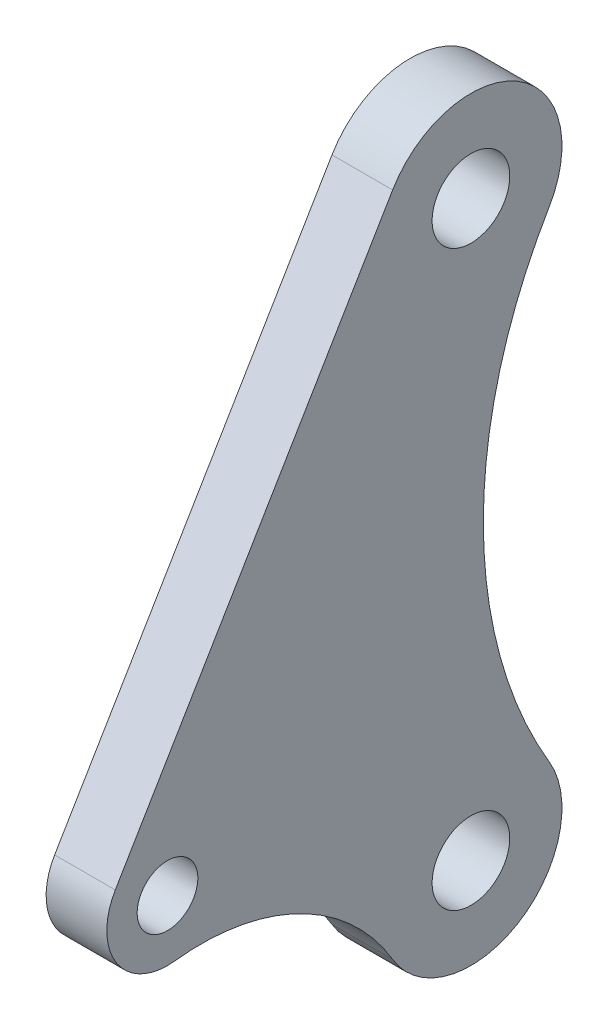
ISO-10303-21;
HEADER;
FILE_DESCRIPTION(('STEP AP214'),'2;1');
FILE_NAME('part.step','',(''),(''),'','','');
FILE_SCHEMA(('AUTOMOTIVE_DESIGN { 1 0 10303 214 1 1 1 1 }'));
ENDSEC;
DATA;
#1=APPLICATION_CONTEXT('core data for automotive mechanical design processes');
#2=APPLICATION_PROTOCOL_DEFINITION('international standard','automotive_design',2000,#1);
#3=PRODUCT_CONTEXT('',#1,'mechanical');
#4=PRODUCT('Part','Part','',(#3));
#5=PRODUCT_RELATED_PRODUCT_CATEGORY('part','',(#4));
#6=PRODUCT_DEFINITION_FORMATION('','',#4);
#7=PRODUCT_DEFINITION_CONTEXT('part definition',#1,'design');
#8=PRODUCT_DEFINITION('design','',#6,#7);
#9=PRODUCT_DEFINITION_SHAPE('','',#8);
#10=(LENGTH_UNIT() NAMED_UNIT(*) SI_UNIT(.MILLI.,.METRE.));
#11=(NAMED_UNIT(*) PLANE_ANGLE_UNIT() SI_UNIT($,.RADIAN.));
#12=(NAMED_UNIT(*) SI_UNIT($,.STERADIAN.) SOLID_ANGLE_UNIT());
#13=UNCERTAINTY_MEASURE_WITH_UNIT(LENGTH_MEASURE(1.E-05),#10,'distance_accuracy_value','');
#14=(GEOMETRIC_REPRESENTATION_CONTEXT(3) GLOBAL_UNCERTAINTY_ASSIGNED_CONTEXT((#13)) GLOBAL_UNIT_ASSIGNED_CONTEXT((#10,
#11,#12)) REPRESENTATION_CONTEXT('',''));
#15=CARTESIAN_POINT('',(0.,0.,0.));
#16=DIRECTION('',(0.,0.,1.));
#17=DIRECTION('',(1.,0.,0.));
#18=AXIS2_PLACEMENT_3D('',#15,#16,#17);
#19=CARTESIAN_POINT('',(3.175,-8.37624187138733,14.1204117999572));
#20=DIRECTION('',(-1.,0.,0.));
#21=DIRECTION('',(0.,0.,-1.));
#22=AXIS2_PLACEMENT_3D('',#19,#20,#21);
#23=CYLINDRICAL_SURFACE('',#22,11.6554005140229);
#24=CARTESIAN_POINT('',(0.,-8.37624187138733,14.1204117999572));
#25=DIRECTION('',(1.,0.,0.));
#26=DIRECTION('',(0.,0.,1.));
#27=AXIS2_PLACEMENT_3D('',#24,#25,#26);
#28=CIRCLE('',#27,11.6554005140229);
#29=CARTESIAN_POINT('',(0.,-2.42977790481856,4.09604511489504));
#30=VERTEX_POINT('',#29);
#31=CARTESIAN_POINT('',(0.,3.19729903973633,15.4993649974343));
#32=VERTEX_POINT('',#31);
#33=EDGE_CURVE('E124',#30,#32,#28,.T.);
#34=ORIENTED_EDGE('',*,*,#33,.F.);
#35=DIRECTION('',(-1.,0.,0.));
#36=VECTOR('',#35,1.);
#37=CARTESIAN_POINT('',(3.175,-2.42977790481856,4.09604511489504));
#38=LINE('',#37,#36);
#39=CARTESIAN_POINT('',(3.175,-2.42977790481856,4.09604511489504));
#40=VERTEX_POINT('',#39);
#41=EDGE_CURVE('E123',#40,#30,#38,.T.);
#42=ORIENTED_EDGE('',*,*,#41,.F.);
#43=CARTESIAN_POINT('',(3.175,-8.37624187138733,14.1204117999572));
#44=DIRECTION('',(1.,0.,0.));
#45=DIRECTION('',(0.,0.,1.));
#46=AXIS2_PLACEMENT_3D('',#43,#44,#45);
#47=CIRCLE('',#46,11.6554005140229);
#48=CARTESIAN_POINT('',(3.175,3.19729903973633,15.4993649974343));
#49=VERTEX_POINT('',#48);
#50=EDGE_CURVE('E137',#40,#49,#47,.T.);
#51=ORIENTED_EDGE('',*,*,#50,.T.);
#52=DIRECTION('',(-1.,0.,0.));
#53=VECTOR('',#52,1.);
#54=CARTESIAN_POINT('',(3.175,3.19729903973633,15.4993649974343));
#55=LINE('',#54,#53);
#56=EDGE_CURVE('E11',#49,#32,#55,.T.);
#57=ORIENTED_EDGE('',*,*,#56,.T.);
#58=EDGE_LOOP('',(#34,#42,#51,#57));
#59=FACE_BOUND('',#58,.T.);
#60=ADVANCED_FACE('F41',(#59),#23,.F.);
#61=CARTESIAN_POINT('',(3.175,6.35,15.875));
#62=DIRECTION('',(-1.,0.,0.));
#63=DIRECTION('',(0.,0.,-1.));
#64=AXIS2_PLACEMENT_3D('',#61,#62,#63);
#65=CYLINDRICAL_SURFACE('',#64,3.175);
#66=CARTESIAN_POINT('',(0.,6.35,15.875));
#67=DIRECTION('',(-1.,0.,0.));
#68=DIRECTION('',(0.,0.,-1.));
#69=AXIS2_PLACEMENT_3D('',#66,#67,#68);
#70=CIRCLE('',#69,3.175);
#71=CARTESIAN_POINT('',(0.,7.96985193654571,18.6056967432634));
#72=VERTEX_POINT('',#71);
#73=EDGE_CURVE('E126',#32,#72,#70,.T.);
#74=ORIENTED_EDGE('',*,*,#73,.F.);
#75=ORIENTED_EDGE('',*,*,#56,.F.);
#76=CARTESIAN_POINT('',(3.175,6.35,15.875));
#77=DIRECTION('',(-1.,0.,0.));
#78=DIRECTION('',(0.,0.,-1.));
#79=AXIS2_PLACEMENT_3D('',#76,#77,#78);
#80=CIRCLE('',#79,3.175);
#81=CARTESIAN_POINT('',(3.175,7.96985193654571,18.6056967432634));
#82=VERTEX_POINT('',#81);
#83=EDGE_CURVE('E89',#49,#82,#80,.T.);
#84=ORIENTED_EDGE('',*,*,#83,.T.);
#85=DIRECTION('',(-1.,0.,0.));
#86=VECTOR('',#85,1.);
#87=CARTESIAN_POINT('',(3.175,7.96985193654571,18.6056967432634));
#88=LINE('',#87,#86);
#89=EDGE_CURVE('E49',#82,#72,#88,.T.);
#90=ORIENTED_EDGE('',*,*,#89,.T.);
#91=EDGE_LOOP('',(#74,#75,#84,#90));
#92=FACE_BOUND('',#91,.T.);
#93=ADVANCED_FACE('F143',(#92),#65,.T.);
#94=CARTESIAN_POINT('',(3.175,32.4297779048186,4.09604511489505));
#95=DIRECTION('',(0.,-0.510189586313607,-0.860061966382161));
#96=DIRECTION('',(0.,-0.860061966382161,0.510189586313607));
#97=AXIS2_PLACEMENT_3D('',#94,#95,#96);
#98=PLANE('',#97);
#99=DIRECTION('',(0.,0.860061966382161,-0.510189586313607));
#100=VECTOR('',#99,1.);
#101=CARTESIAN_POINT('',(0.,32.4297779048186,4.09604511489505));
#102=LINE('',#101,#100);
#103=CARTESIAN_POINT('',(0.,32.4297779048186,4.09604511489504));
#104=VERTEX_POINT('',#103);
#105=EDGE_CURVE('E130',#72,#104,#102,.T.);
#106=ORIENTED_EDGE('',*,*,#105,.F.);
#107=ORIENTED_EDGE('',*,*,#89,.F.);
#108=DIRECTION('',(0.,0.860061966382161,-0.510189586313607));
#109=VECTOR('',#108,1.);
#110=CARTESIAN_POINT('',(3.175,32.4297779048186,4.09604511489505));
#111=LINE('',#110,#109);
#112=CARTESIAN_POINT('',(3.175,32.4297779048186,4.09604511489504));
#113=VERTEX_POINT('',#112);
#114=EDGE_CURVE('E117',#82,#113,#111,.T.);
#115=ORIENTED_EDGE('',*,*,#114,.T.);
#116=DIRECTION('',(-1.,0.,0.));
#117=VECTOR('',#116,1.);
#118=CARTESIAN_POINT('',(3.175,32.4297779048186,4.09604511489504));
#119=LINE('',#118,#117);
#120=EDGE_CURVE('E111',#113,#104,#119,.T.);
#121=ORIENTED_EDGE('',*,*,#120,.T.);
#122=EDGE_LOOP('',(#106,#107,#115,#121));
#123=FACE_BOUND('',#122,.T.);
#124=ADVANCED_FACE('F200',(#123),#98,.F.);
#125=CARTESIAN_POINT('',(3.175,30.,0.));
#126=DIRECTION('',(-1.,0.,0.));
#127=DIRECTION('',(0.,0.,-1.));
#128=AXIS2_PLACEMENT_3D('',#125,#126,#127);
#129=CYLINDRICAL_SURFACE('',#128,4.7625);
#130=CARTESIAN_POINT('',(0.,30.,0.));
#131=DIRECTION('',(-1.,0.,0.));
#132=DIRECTION('',(0.,0.,-1.));
#133=AXIS2_PLACEMENT_3D('',#130,#131,#132);
#134=CIRCLE('',#133,4.7625);
#135=CARTESIAN_POINT('',(0.,27.5702220951814,-4.09604511489504));
#136=VERTEX_POINT('',#135);
#137=EDGE_CURVE('E133',#104,#136,#134,.T.);
#138=ORIENTED_EDGE('',*,*,#137,.F.);
#139=ORIENTED_EDGE('',*,*,#120,.F.);
#140=CARTESIAN_POINT('',(3.175,30.,0.));
#141=DIRECTION('',(-1.,0.,0.));
#142=DIRECTION('',(0.,0.,-1.));
#143=AXIS2_PLACEMENT_3D('',#140,#141,#142);
#144=CIRCLE('',#143,4.7625);
#145=CARTESIAN_POINT('',(3.175,27.5702220951814,-4.09604511489504));
#146=VERTEX_POINT('',#145);
#147=EDGE_CURVE('E101',#113,#146,#144,.T.);
#148=ORIENTED_EDGE('',*,*,#147,.T.);
#149=DIRECTION('',(-1.,0.,0.));
#150=VECTOR('',#149,1.);
#151=CARTESIAN_POINT('',(3.175,27.5702220951814,-4.09604511489504));
#152=LINE('',#151,#150);
#153=EDGE_CURVE('E106',#146,#136,#152,.T.);
#154=ORIENTED_EDGE('',*,*,#153,.T.);
#155=EDGE_LOOP('',(#138,#139,#148,#154));
#156=FACE_BOUND('',#155,.T.);
#157=ADVANCED_FACE('F114',(#156),#129,.T.);
#158=CARTESIAN_POINT('',(3.175,15.,-25.2865402231129));
#159=DIRECTION('',(-1.,0.,0.));
#160=DIRECTION('',(0.,0.,-1.));
#161=AXIS2_PLACEMENT_3D('',#158,#159,#160);
#162=CYLINDRICAL_SURFACE('',#161,24.6383353019962);
#163=CARTESIAN_POINT('',(0.,15.,-25.2865402231129));
#164=DIRECTION('',(1.,0.,0.));
#165=DIRECTION('',(0.,0.,-1.));
#166=AXIS2_PLACEMENT_3D('',#163,#164,#165);
#167=CIRCLE('',#166,24.6383353019962);
#168=CARTESIAN_POINT('',(0.,2.42977790481856,-4.09604511489504));
#169=VERTEX_POINT('',#168);
#170=EDGE_CURVE('E108',#136,#169,#167,.T.);
#171=ORIENTED_EDGE('',*,*,#170,.F.);
#172=ORIENTED_EDGE('',*,*,#153,.F.);
#173=CARTESIAN_POINT('',(3.175,15.,-25.2865402231129));
#174=DIRECTION('',(1.,0.,0.));
#175=DIRECTION('',(0.,0.,-1.));
#176=AXIS2_PLACEMENT_3D('',#173,#174,#175);
#177=CIRCLE('',#176,24.6383353019962);
#178=CARTESIAN_POINT('',(3.175,2.42977790481856,-4.09604511489504));
#179=VERTEX_POINT('',#178);
#180=EDGE_CURVE('E97',#146,#179,#177,.T.);
#181=ORIENTED_EDGE('',*,*,#180,.T.);
#182=DIRECTION('',(-1.,0.,0.));
#183=VECTOR('',#182,1.);
#184=CARTESIAN_POINT('',(3.175,2.42977790481856,-4.09604511489504));
#185=LINE('',#184,#183);
#186=EDGE_CURVE('E112',#179,#169,#185,.T.);
#187=ORIENTED_EDGE('',*,*,#186,.T.);
#188=EDGE_LOOP('',(#171,#172,#181,#187));
#189=FACE_BOUND('',#188,.T.);
#190=ADVANCED_FACE('F107',(#189),#162,.F.);
#191=CARTESIAN_POINT('',(3.175,0.,0.));
#192=DIRECTION('',(-1.,0.,0.));
#193=DIRECTION('',(0.,0.,-1.));
#194=AXIS2_PLACEMENT_3D('',#191,#192,#193);
#195=CYLINDRICAL_SURFACE('',#194,4.7625);
#196=CARTESIAN_POINT('',(0.,0.,0.));
#197=DIRECTION('',(-1.,0.,0.));
#198=DIRECTION('',(0.,0.,-1.));
#199=AXIS2_PLACEMENT_3D('',#196,#197,#198);
#200=CIRCLE('',#199,4.7625);
#201=EDGE_CURVE('E77',#169,#30,#200,.T.);
#202=ORIENTED_EDGE('',*,*,#201,.F.);
#203=ORIENTED_EDGE('',*,*,#186,.F.);
#204=CARTESIAN_POINT('',(3.175,0.,0.));
#205=DIRECTION('',(-1.,0.,0.));
#206=DIRECTION('',(0.,0.,-1.));
#207=AXIS2_PLACEMENT_3D('',#204,#205,#206);
#208=CIRCLE('',#207,4.7625);
#209=EDGE_CURVE('E57',#179,#40,#208,.T.);
#210=ORIENTED_EDGE('',*,*,#209,.T.);
#211=ORIENTED_EDGE('',*,*,#41,.T.);
#212=EDGE_LOOP('',(#202,#203,#210,#211));
#213=FACE_BOUND('',#212,.T.);
#214=ADVANCED_FACE('F188',(#213),#195,.T.);
#215=CARTESIAN_POINT('',(3.175,-8.37624187138733,14.1204117999572));
#216=DIRECTION('',(1.,0.,0.));
#217=DIRECTION('',(0.,0.,1.));
#218=AXIS2_PLACEMENT_3D('',#215,#216,#217);
#219=PLANE('',#218);
#220=CARTESIAN_POINT('',(3.175,30.,0.));
#221=DIRECTION('',(-1.,0.,0.));
#222=DIRECTION('',(0.,0.,1.));
#223=AXIS2_PLACEMENT_3D('',#220,#221,#222);
#224=CIRCLE('',#223,2.032);
#225=CARTESIAN_POINT('',(3.175,30.,2.032));
#226=VERTEX_POINT('',#225);
#227=EDGE_CURVE('E164',#226,#226,#224,.T.);
#228=ORIENTED_EDGE('',*,*,#227,.T.);
#229=EDGE_LOOP('',(#228));
#230=FACE_BOUND('',#229,.T.);
#231=CARTESIAN_POINT('',(3.175,0.,0.));
#232=DIRECTION('',(-1.,0.,0.));
#233=DIRECTION('',(0.,0.,1.));
#234=AXIS2_PLACEMENT_3D('',#231,#232,#233);
#235=CIRCLE('',#234,2.032);
#236=CARTESIAN_POINT('',(3.175,0.,2.032));
#237=VERTEX_POINT('',#236);
#238=EDGE_CURVE('E161',#237,#237,#235,.T.);
#239=ORIENTED_EDGE('',*,*,#238,.T.);
#240=EDGE_LOOP('',(#239));
#241=FACE_BOUND('',#240,.T.);
#242=CARTESIAN_POINT('',(3.175,6.35,15.875));
#243=DIRECTION('',(-1.,0.,0.));
#244=DIRECTION('',(0.,0.,1.));
#245=AXIS2_PLACEMENT_3D('',#242,#243,#244);
#246=CIRCLE('',#245,1.5875);
#247=CARTESIAN_POINT('',(3.175,6.35,17.4625));
#248=VERTEX_POINT('',#247);
#249=EDGE_CURVE('E155',#248,#248,#246,.T.);
#250=ORIENTED_EDGE('',*,*,#249,.T.);
#251=EDGE_LOOP('',(#250));
#252=FACE_BOUND('',#251,.T.);
#253=ORIENTED_EDGE('',*,*,#50,.F.);
#254=ORIENTED_EDGE('',*,*,#209,.F.);
#255=ORIENTED_EDGE('',*,*,#180,.F.);
#256=ORIENTED_EDGE('',*,*,#147,.F.);
#257=ORIENTED_EDGE('',*,*,#114,.F.);
#258=ORIENTED_EDGE('',*,*,#83,.F.);
#259=EDGE_LOOP('',(#253,#254,#255,#256,#257,#258));
#260=FACE_BOUND('',#259,.T.);
#261=ADVANCED_FACE('F99',(#230,#241,#252,#260),#219,.T.);
#262=CARTESIAN_POINT('',(0.,-8.37624187138733,14.1204117999572));
#263=DIRECTION('',(1.,0.,0.));
#264=DIRECTION('',(0.,0.,1.));
#265=AXIS2_PLACEMENT_3D('',#262,#263,#264);
#266=PLANE('',#265);
#267=CARTESIAN_POINT('',(0.,30.,0.));
#268=DIRECTION('',(-1.,0.,0.));
#269=DIRECTION('',(0.,0.,1.));
#270=AXIS2_PLACEMENT_3D('',#267,#268,#269);
#271=CIRCLE('',#270,2.032);
#272=CARTESIAN_POINT('',(0.,30.,2.032));
#273=VERTEX_POINT('',#272);
#274=EDGE_CURVE('E127',#273,#273,#271,.T.);
#275=ORIENTED_EDGE('',*,*,#274,.F.);
#276=EDGE_LOOP('',(#275));
#277=FACE_BOUND('',#276,.T.);
#278=CARTESIAN_POINT('',(0.,0.,0.));
#279=DIRECTION('',(-1.,0.,0.));
#280=DIRECTION('',(0.,0.,1.));
#281=AXIS2_PLACEMENT_3D('',#278,#279,#280);
#282=CIRCLE('',#281,2.032);
#283=CARTESIAN_POINT('',(0.,0.,2.032));
#284=VERTEX_POINT('',#283);
#285=EDGE_CURVE('E158',#284,#284,#282,.T.);
#286=ORIENTED_EDGE('',*,*,#285,.F.);
#287=EDGE_LOOP('',(#286));
#288=FACE_BOUND('',#287,.T.);
#289=CARTESIAN_POINT('',(0.,6.35,15.875));
#290=DIRECTION('',(-1.,0.,0.));
#291=DIRECTION('',(0.,0.,1.));
#292=AXIS2_PLACEMENT_3D('',#289,#290,#291);
#293=CIRCLE('',#292,1.5875);
#294=CARTESIAN_POINT('',(0.,6.35,17.4625));
#295=VERTEX_POINT('',#294);
#296=EDGE_CURVE('E152',#295,#295,#293,.T.);
#297=ORIENTED_EDGE('',*,*,#296,.F.);
#298=EDGE_LOOP('',(#297));
#299=FACE_BOUND('',#298,.T.);
#300=ORIENTED_EDGE('',*,*,#33,.T.);
#301=ORIENTED_EDGE('',*,*,#73,.T.);
#302=ORIENTED_EDGE('',*,*,#105,.T.);
#303=ORIENTED_EDGE('',*,*,#137,.T.);
#304=ORIENTED_EDGE('',*,*,#170,.T.);
#305=ORIENTED_EDGE('',*,*,#201,.T.);
#306=EDGE_LOOP('',(#300,#301,#302,#303,#304,#305));
#307=FACE_BOUND('',#306,.T.);
#308=ADVANCED_FACE('F145',(#277,#288,#299,#307),#266,.F.);
#309=CARTESIAN_POINT('',(0.,6.35,15.875));
#310=DIRECTION('',(1.,0.,0.));
#311=DIRECTION('',(0.,0.,1.));
#312=AXIS2_PLACEMENT_3D('',#309,#310,#311);
#313=CYLINDRICAL_SURFACE('',#312,1.5875);
#314=ORIENTED_EDGE('',*,*,#296,.T.);
#315=EDGE_LOOP('',(#314));
#316=FACE_BOUND('',#315,.T.);
#317=ORIENTED_EDGE('',*,*,#249,.F.);
#318=EDGE_LOOP('',(#317));
#319=FACE_BOUND('',#318,.T.);
#320=ADVANCED_FACE('F175',(#316,#319),#313,.F.);
#321=CARTESIAN_POINT('',(0.,0.,0.));
#322=DIRECTION('',(1.,0.,0.));
#323=DIRECTION('',(0.,0.,1.));
#324=AXIS2_PLACEMENT_3D('',#321,#322,#323);
#325=CYLINDRICAL_SURFACE('',#324,2.032);
#326=ORIENTED_EDGE('',*,*,#285,.T.);
#327=EDGE_LOOP('',(#326));
#328=FACE_BOUND('',#327,.T.);
#329=ORIENTED_EDGE('',*,*,#238,.F.);
#330=EDGE_LOOP('',(#329));
#331=FACE_BOUND('',#330,.T.);
#332=ADVANCED_FACE('F183',(#328,#331),#325,.F.);
#333=CARTESIAN_POINT('',(0.,30.,0.));
#334=DIRECTION('',(1.,0.,0.));
#335=DIRECTION('',(0.,0.,1.));
#336=AXIS2_PLACEMENT_3D('',#333,#334,#335);
#337=CYLINDRICAL_SURFACE('',#336,2.032);
#338=ORIENTED_EDGE('',*,*,#274,.T.);
#339=EDGE_LOOP('',(#338));
#340=FACE_BOUND('',#339,.T.);
#341=ORIENTED_EDGE('',*,*,#227,.F.);
#342=EDGE_LOOP('',(#341));
#343=FACE_BOUND('',#342,.T.);
#344=ADVANCED_FACE('F170',(#340,#343),#337,.F.);
#345=CLOSED_SHELL('',(#60,#93,#124,#157,#190,#214,#261,#308,#320,#332,#344));
#346=MANIFOLD_SOLID_BREP('B2',#345);
#347=ADVANCED_BREP_SHAPE_REPRESENTATION('',(#18,#346),#14);
#348=SHAPE_DEFINITION_REPRESENTATION(#9,#347);
ENDSEC;
END-ISO-10303-21;
